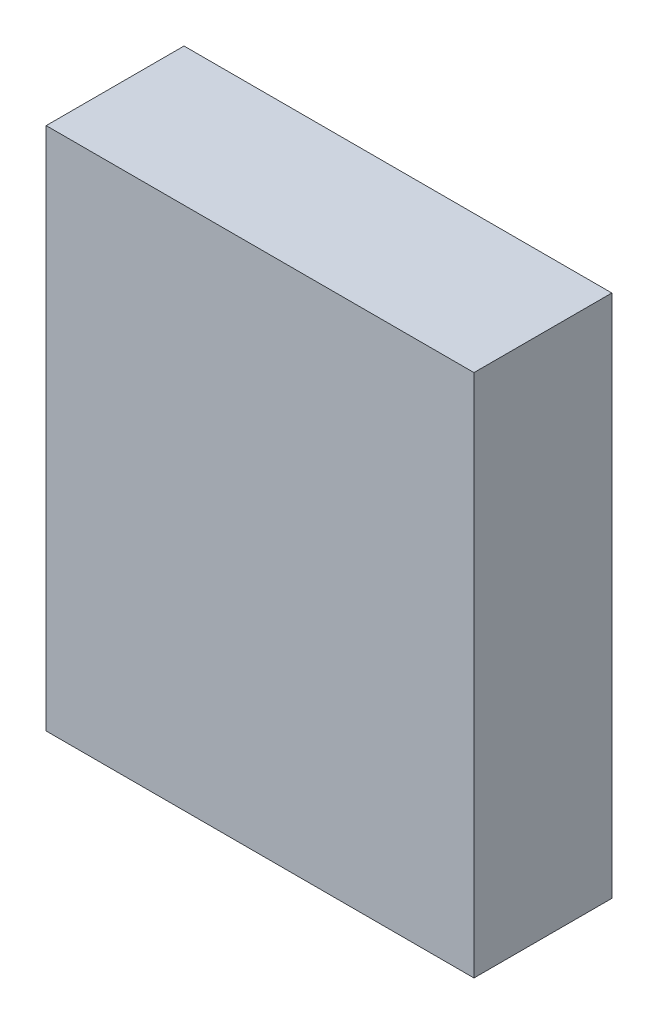
ISO-10303-21;
HEADER;
FILE_DESCRIPTION(('STEP AP214'),'2;1');
FILE_NAME('part.step','',(''),(''),'','','');
FILE_SCHEMA(('AUTOMOTIVE_DESIGN { 1 0 10303 214 1 1 1 1 }'));
ENDSEC;
DATA;
#1=APPLICATION_CONTEXT('core data for automotive mechanical design processes');
#2=APPLICATION_PROTOCOL_DEFINITION('international standard','automotive_design',2000,#1);
#3=PRODUCT_CONTEXT('',#1,'mechanical');
#4=PRODUCT('Part','Part','',(#3));
#5=PRODUCT_RELATED_PRODUCT_CATEGORY('part','',(#4));
#6=PRODUCT_DEFINITION_FORMATION('','',#4);
#7=PRODUCT_DEFINITION_CONTEXT('part definition',#1,'design');
#8=PRODUCT_DEFINITION('design','',#6,#7);
#9=PRODUCT_DEFINITION_SHAPE('','',#8);
#10=(LENGTH_UNIT() NAMED_UNIT(*) SI_UNIT(.MILLI.,.METRE.));
#11=(NAMED_UNIT(*) PLANE_ANGLE_UNIT() SI_UNIT($,.RADIAN.));
#12=(NAMED_UNIT(*) SI_UNIT($,.STERADIAN.) SOLID_ANGLE_UNIT());
#13=UNCERTAINTY_MEASURE_WITH_UNIT(LENGTH_MEASURE(1.E-05),#10,'distance_accuracy_value','');
#14=(GEOMETRIC_REPRESENTATION_CONTEXT(3) GLOBAL_UNCERTAINTY_ASSIGNED_CONTEXT((#13)) GLOBAL_UNIT_ASSIGNED_CONTEXT((#10,
#11,#12)) REPRESENTATION_CONTEXT('',''));
#15=CARTESIAN_POINT('',(0.,0.,0.));
#16=DIRECTION('',(0.,0.,1.));
#17=DIRECTION('',(1.,0.,0.));
#18=AXIS2_PLACEMENT_3D('',#15,#16,#17);
#19=CARTESIAN_POINT('',(-1.5515971,1.90159894,1.00000054));
#20=DIRECTION('',(0.,0.,1.));
#21=DIRECTION('',(1.,0.,0.));
#22=AXIS2_PLACEMENT_3D('',#19,#20,#21);
#23=PLANE('',#22);
#24=DIRECTION('',(6.67859466615551E-07,0.999999999999777,0.));
#25=VECTOR('',#24,1.);
#26=CARTESIAN_POINT('',(-1.55159964,-1.9015964,1.00000054));
#27=LINE('',#26,#25);
#28=CARTESIAN_POINT('',(-1.55159964,-1.9015964,1.00000054));
#29=VERTEX_POINT('',#28);
#30=CARTESIAN_POINT('',(-1.5515971,1.90159894,1.00000054));
#31=VERTEX_POINT('',#30);
#32=EDGE_CURVE('E26',#29,#31,#27,.T.);
#33=ORIENTED_EDGE('',*,*,#32,.F.);
#34=DIRECTION('',(-0.999999999999665,8.18510114179626E-07,0.));
#35=VECTOR('',#34,1.);
#36=CARTESIAN_POINT('',(1.55159964,-1.90159894,1.00000054));
#37=LINE('',#36,#35);
#38=CARTESIAN_POINT('',(1.55159964,-1.90159894,1.00000054));
#39=VERTEX_POINT('',#38);
#40=EDGE_CURVE('E78',#39,#29,#37,.T.);
#41=ORIENTED_EDGE('',*,*,#40,.F.);
#42=DIRECTION('',(6.67859020579551E-07,-0.999999999999777,0.));
#43=VECTOR('',#42,1.);
#44=CARTESIAN_POINT('',(1.5515971,1.90159894,1.00000054));
#45=LINE('',#44,#43);
#46=CARTESIAN_POINT('',(1.5515971,1.90159894,1.00000054));
#47=VERTEX_POINT('',#46);
#48=EDGE_CURVE('E85',#47,#39,#45,.T.);
#49=ORIENTED_EDGE('',*,*,#48,.F.);
#50=DIRECTION('',(1.,0.,0.));
#51=VECTOR('',#50,1.);
#52=CARTESIAN_POINT('',(-1.5515971,1.90159894,1.00000054));
#53=LINE('',#52,#51);
#54=EDGE_CURVE('E88',#31,#47,#53,.T.);
#55=ORIENTED_EDGE('',*,*,#54,.F.);
#56=EDGE_LOOP('',(#33,#41,#49,#55));
#57=FACE_BOUND('',#56,.T.);
#58=ADVANCED_FACE('F16',(#57),#23,.T.);
#59=CARTESIAN_POINT('',(-1.5515971,1.90159894,0.));
#60=DIRECTION('',(0.,0.,1.));
#61=DIRECTION('',(1.,0.,0.));
#62=AXIS2_PLACEMENT_3D('',#59,#60,#61);
#63=PLANE('',#62);
#64=DIRECTION('',(1.,0.,0.));
#65=VECTOR('',#64,1.);
#66=CARTESIAN_POINT('',(-1.5515971,1.90159894,0.));
#67=LINE('',#66,#65);
#68=CARTESIAN_POINT('',(-1.5515971,1.90159894,0.));
#69=VERTEX_POINT('',#68);
#70=CARTESIAN_POINT('',(1.5515971,1.90159894,0.));
#71=VERTEX_POINT('',#70);
#72=EDGE_CURVE('E19',#69,#71,#67,.T.);
#73=ORIENTED_EDGE('',*,*,#72,.T.);
#74=DIRECTION('',(6.67859020579551E-07,-0.999999999999777,0.));
#75=VECTOR('',#74,1.);
#76=CARTESIAN_POINT('',(1.5515971,1.90159894,0.));
#77=LINE('',#76,#75);
#78=CARTESIAN_POINT('',(1.55159964,-1.90159894,0.));
#79=VERTEX_POINT('',#78);
#80=EDGE_CURVE('E67',#71,#79,#77,.T.);
#81=ORIENTED_EDGE('',*,*,#80,.T.);
#82=DIRECTION('',(-0.999999999999665,8.18510114179626E-07,0.));
#83=VECTOR('',#82,1.);
#84=CARTESIAN_POINT('',(1.55159964,-1.90159894,0.));
#85=LINE('',#84,#83);
#86=CARTESIAN_POINT('',(-1.55159964,-1.9015964,0.));
#87=VERTEX_POINT('',#86);
#88=EDGE_CURVE('E110',#79,#87,#85,.T.);
#89=ORIENTED_EDGE('',*,*,#88,.T.);
#90=DIRECTION('',(6.67859466615551E-07,0.999999999999777,0.));
#91=VECTOR('',#90,1.);
#92=CARTESIAN_POINT('',(-1.55159964,-1.9015964,0.));
#93=LINE('',#92,#91);
#94=EDGE_CURVE('E11',#87,#69,#93,.T.);
#95=ORIENTED_EDGE('',*,*,#94,.T.);
#96=EDGE_LOOP('',(#73,#81,#89,#95));
#97=FACE_BOUND('',#96,.T.);
#98=ADVANCED_FACE('F81',(#97),#63,.F.);
#99=CARTESIAN_POINT('',(-1.55159964,-1.9015964,0.));
#100=DIRECTION('',(-0.999999999999777,6.67859466615551E-07,0.));
#101=DIRECTION('',(0.,0.,1.));
#102=AXIS2_PLACEMENT_3D('',#99,#100,#101);
#103=PLANE('',#102);
#104=DIRECTION('',(0.,0.,1.));
#105=VECTOR('',#104,1.);
#106=CARTESIAN_POINT('',(-1.55159964,-1.9015964,0.));
#107=LINE('',#106,#105);
#108=EDGE_CURVE('E102',#87,#29,#107,.T.);
#109=ORIENTED_EDGE('',*,*,#108,.T.);
#110=ORIENTED_EDGE('',*,*,#32,.T.);
#111=DIRECTION('',(0.,0.,1.));
#112=VECTOR('',#111,1.);
#113=CARTESIAN_POINT('',(-1.5515971,1.90159894,0.));
#114=LINE('',#113,#112);
#115=EDGE_CURVE('E95',#69,#31,#114,.T.);
#116=ORIENTED_EDGE('',*,*,#115,.F.);
#117=ORIENTED_EDGE('',*,*,#94,.F.);
#118=EDGE_LOOP('',(#109,#110,#116,#117));
#119=FACE_BOUND('',#118,.T.);
#120=ADVANCED_FACE('F113',(#119),#103,.T.);
#121=CARTESIAN_POINT('',(1.55159964,-1.90159894,0.));
#122=DIRECTION('',(-8.18510114179626E-07,-0.999999999999665,0.));
#123=DIRECTION('',(-0.999999999999665,8.18510114179626E-07,0.));
#124=AXIS2_PLACEMENT_3D('',#121,#122,#123);
#125=PLANE('',#124);
#126=DIRECTION('',(0.,0.,1.));
#127=VECTOR('',#126,1.);
#128=CARTESIAN_POINT('',(1.55159964,-1.90159894,0.));
#129=LINE('',#128,#127);
#130=EDGE_CURVE('E75',#79,#39,#129,.T.);
#131=ORIENTED_EDGE('',*,*,#130,.T.);
#132=ORIENTED_EDGE('',*,*,#40,.T.);
#133=ORIENTED_EDGE('',*,*,#108,.F.);
#134=ORIENTED_EDGE('',*,*,#88,.F.);
#135=EDGE_LOOP('',(#131,#132,#133,#134));
#136=FACE_BOUND('',#135,.T.);
#137=ADVANCED_FACE('F108',(#136),#125,.T.);
#138=CARTESIAN_POINT('',(1.5515971,1.90159894,0.));
#139=DIRECTION('',(0.999999999999777,6.67859020579551E-07,0.));
#140=DIRECTION('',(0.,0.,-1.));
#141=AXIS2_PLACEMENT_3D('',#138,#139,#140);
#142=PLANE('',#141);
#143=DIRECTION('',(0.,0.,1.));
#144=VECTOR('',#143,1.);
#145=CARTESIAN_POINT('',(1.5515971,1.90159894,0.));
#146=LINE('',#145,#144);
#147=EDGE_CURVE('E72',#71,#47,#146,.T.);
#148=ORIENTED_EDGE('',*,*,#147,.T.);
#149=ORIENTED_EDGE('',*,*,#48,.T.);
#150=ORIENTED_EDGE('',*,*,#130,.F.);
#151=ORIENTED_EDGE('',*,*,#80,.F.);
#152=EDGE_LOOP('',(#148,#149,#150,#151));
#153=FACE_BOUND('',#152,.T.);
#154=ADVANCED_FACE('F69',(#153),#142,.T.);
#155=CARTESIAN_POINT('',(-1.5515971,1.90159894,0.));
#156=DIRECTION('',(0.,1.,0.));
#157=DIRECTION('',(1.,0.,0.));
#158=AXIS2_PLACEMENT_3D('',#155,#156,#157);
#159=PLANE('',#158);
#160=ORIENTED_EDGE('',*,*,#115,.T.);
#161=ORIENTED_EDGE('',*,*,#54,.T.);
#162=ORIENTED_EDGE('',*,*,#147,.F.);
#163=ORIENTED_EDGE('',*,*,#72,.F.);
#164=EDGE_LOOP('',(#160,#161,#162,#163));
#165=FACE_BOUND('',#164,.T.);
#166=ADVANCED_FACE('F86',(#165),#159,.T.);
#167=CLOSED_SHELL('',(#58,#98,#120,#137,#154,#166));
#168=MANIFOLD_SOLID_BREP('B1',#167);
#169=ADVANCED_BREP_SHAPE_REPRESENTATION('',(#18,#168),#14);
#170=SHAPE_DEFINITION_REPRESENTATION(#9,#169);
ENDSEC;
END-ISO-10303-21;
